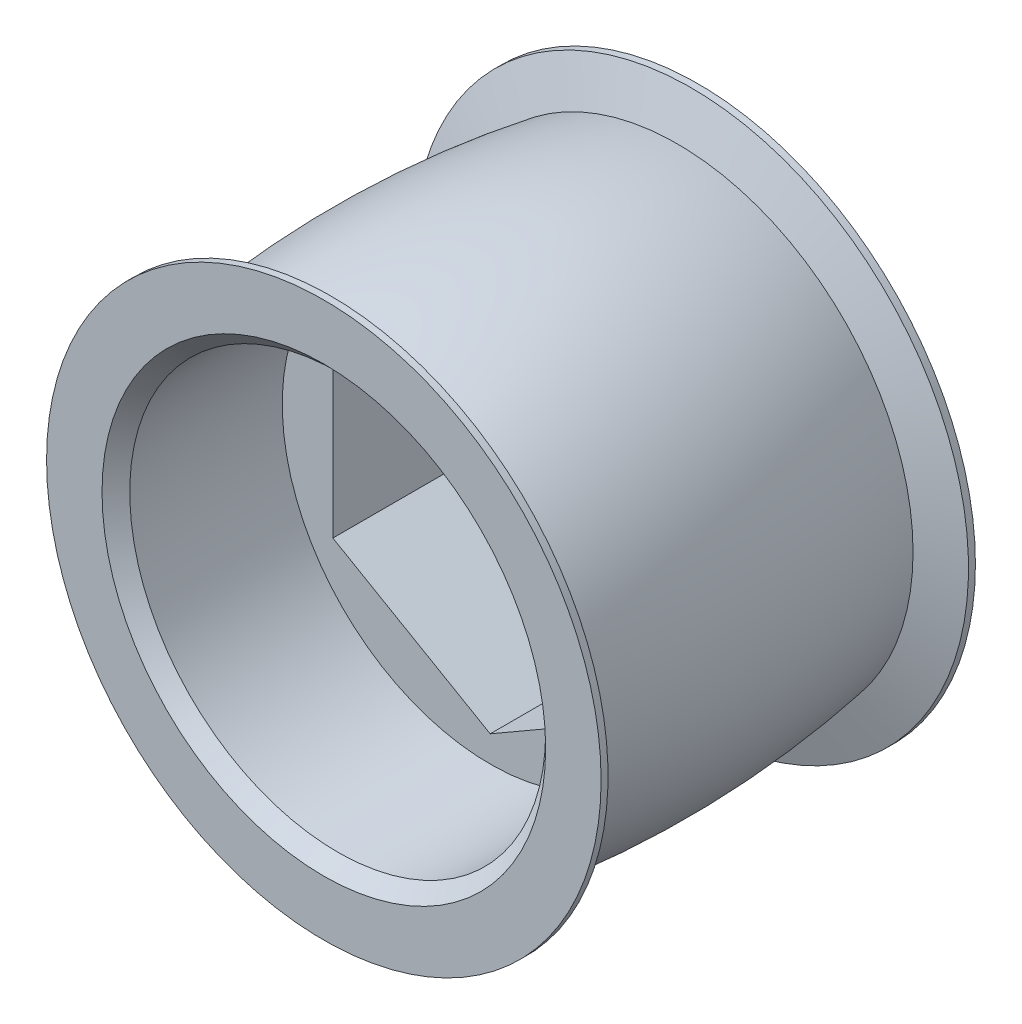
ISO-10303-21;
HEADER;
FILE_DESCRIPTION(('STEP AP214'),'2;1');
FILE_NAME('part.step','',(''),(''),'','','');
FILE_SCHEMA(('AUTOMOTIVE_DESIGN { 1 0 10303 214 1 1 1 1 }'));
ENDSEC;
DATA;
#1=APPLICATION_CONTEXT('core data for automotive mechanical design processes');
#2=APPLICATION_PROTOCOL_DEFINITION('international standard','automotive_design',2000,#1);
#3=PRODUCT_CONTEXT('',#1,'mechanical');
#4=PRODUCT('Part','Part','',(#3));
#5=PRODUCT_RELATED_PRODUCT_CATEGORY('part','',(#4));
#6=PRODUCT_DEFINITION_FORMATION('','',#4);
#7=PRODUCT_DEFINITION_CONTEXT('part definition',#1,'design');
#8=PRODUCT_DEFINITION('design','',#6,#7);
#9=PRODUCT_DEFINITION_SHAPE('','',#8);
#10=(LENGTH_UNIT() NAMED_UNIT(*) SI_UNIT(.MILLI.,.METRE.));
#11=(NAMED_UNIT(*) PLANE_ANGLE_UNIT() SI_UNIT($,.RADIAN.));
#12=(NAMED_UNIT(*) SI_UNIT($,.STERADIAN.) SOLID_ANGLE_UNIT());
#13=UNCERTAINTY_MEASURE_WITH_UNIT(LENGTH_MEASURE(1.E-05),#10,'distance_accuracy_value','');
#14=(GEOMETRIC_REPRESENTATION_CONTEXT(3) GLOBAL_UNCERTAINTY_ASSIGNED_CONTEXT((#13)) GLOBAL_UNIT_ASSIGNED_CONTEXT((#10,
#11,#12)) REPRESENTATION_CONTEXT('',''));
#15=CARTESIAN_POINT('',(0.,0.,0.));
#16=DIRECTION('',(0.,0.,1.));
#17=DIRECTION('',(1.,0.,0.));
#18=AXIS2_PLACEMENT_3D('',#15,#16,#17);
#19=CARTESIAN_POINT('',(0.,-8.,27.));
#20=DIRECTION('',(0.,0.,-1.));
#21=DIRECTION('',(-1.,0.,0.));
#22=AXIS2_PLACEMENT_3D('',#19,#20,#21);
#23=CYLINDRICAL_SURFACE('',#22,1.25);
#24=CARTESIAN_POINT('',(0.,-8.,7.));
#25=DIRECTION('',(0.,0.,1.));
#26=DIRECTION('',(1.,0.,0.));
#27=AXIS2_PLACEMENT_3D('',#24,#25,#26);
#28=CIRCLE('',#27,1.25);
#29=CARTESIAN_POINT('',(1.24999999999992,-8.,7.));
#30=VERTEX_POINT('',#29);
#31=EDGE_CURVE('E160',#30,#30,#28,.T.);
#32=ORIENTED_EDGE('',*,*,#31,.T.);
#33=EDGE_LOOP('',(#32));
#34=FACE_BOUND('',#33,.T.);
#35=CARTESIAN_POINT('',(0.,-8.,4.));
#36=DIRECTION('',(0.,0.,-1.));
#37=DIRECTION('',(-1.,0.,0.));
#38=AXIS2_PLACEMENT_3D('',#35,#36,#37);
#39=CIRCLE('',#38,1.25);
#40=CARTESIAN_POINT('',(-1.25000000000008,-8.,4.));
#41=VERTEX_POINT('',#40);
#42=EDGE_CURVE('E39',#41,#41,#39,.F.);
#43=ORIENTED_EDGE('',*,*,#42,.F.);
#44=EDGE_LOOP('',(#43));
#45=FACE_BOUND('',#44,.T.);
#46=ADVANCED_FACE('F35',(#34,#45),#23,.F.);
#47=CARTESIAN_POINT('',(-6.92820323027551,4.,27.));
#48=DIRECTION('',(0.,0.,-1.));
#49=DIRECTION('',(-1.,0.,0.));
#50=AXIS2_PLACEMENT_3D('',#47,#48,#49);
#51=CYLINDRICAL_SURFACE('',#50,1.25);
#52=CARTESIAN_POINT('',(-6.92820323027551,4.,7.));
#53=DIRECTION('',(0.,0.,1.));
#54=DIRECTION('',(1.,0.,0.));
#55=AXIS2_PLACEMENT_3D('',#52,#53,#54);
#56=CIRCLE('',#55,1.25);
#57=CARTESIAN_POINT('',(-5.67820323027551,4.,7.));
#58=VERTEX_POINT('',#57);
#59=EDGE_CURVE('E159',#58,#58,#56,.T.);
#60=ORIENTED_EDGE('',*,*,#59,.T.);
#61=EDGE_LOOP('',(#60));
#62=FACE_BOUND('',#61,.T.);
#63=CARTESIAN_POINT('',(-6.92820323027551,4.,4.));
#64=DIRECTION('',(0.,0.,-1.));
#65=DIRECTION('',(-1.,0.,0.));
#66=AXIS2_PLACEMENT_3D('',#63,#64,#65);
#67=CIRCLE('',#66,1.25);
#68=CARTESIAN_POINT('',(-8.17820323027551,4.,4.));
#69=VERTEX_POINT('',#68);
#70=EDGE_CURVE('E168',#69,#69,#67,.F.);
#71=ORIENTED_EDGE('',*,*,#70,.F.);
#72=EDGE_LOOP('',(#71));
#73=FACE_BOUND('',#72,.T.);
#74=ADVANCED_FACE('F230',(#62,#73),#51,.F.);
#75=CARTESIAN_POINT('',(6.92820323027553,3.99999999999996,27.));
#76=DIRECTION('',(0.,0.,-1.));
#77=DIRECTION('',(-1.,0.,0.));
#78=AXIS2_PLACEMENT_3D('',#75,#76,#77);
#79=CYLINDRICAL_SURFACE('',#78,1.25);
#80=CARTESIAN_POINT('',(6.92820323027553,3.99999999999996,7.));
#81=DIRECTION('',(0.,0.,1.));
#82=DIRECTION('',(1.,0.,0.));
#83=AXIS2_PLACEMENT_3D('',#80,#81,#82);
#84=CIRCLE('',#83,1.25);
#85=CARTESIAN_POINT('',(8.17820323027553,3.99999999999996,7.));
#86=VERTEX_POINT('',#85);
#87=EDGE_CURVE('E155',#86,#86,#84,.T.);
#88=ORIENTED_EDGE('',*,*,#87,.T.);
#89=EDGE_LOOP('',(#88));
#90=FACE_BOUND('',#89,.T.);
#91=CARTESIAN_POINT('',(6.92820323027553,3.99999999999996,4.));
#92=DIRECTION('',(0.,0.,-1.));
#93=DIRECTION('',(-1.,0.,0.));
#94=AXIS2_PLACEMENT_3D('',#91,#92,#93);
#95=CIRCLE('',#94,1.25);
#96=CARTESIAN_POINT('',(5.67820323027553,3.99999999999996,4.));
#97=VERTEX_POINT('',#96);
#98=EDGE_CURVE('E163',#97,#97,#95,.F.);
#99=ORIENTED_EDGE('',*,*,#98,.F.);
#100=EDGE_LOOP('',(#99));
#101=FACE_BOUND('',#100,.T.);
#102=ADVANCED_FACE('F236',(#90,#101),#79,.F.);
#103=CARTESIAN_POINT('',(0.,0.,15.));
#104=DIRECTION('',(0.,0.,-1.));
#105=DIRECTION('',(-1.,0.,0.));
#106=AXIS2_PLACEMENT_3D('',#103,#104,#105);
#107=CYLINDRICAL_SURFACE('',#106,20.);
#108=CARTESIAN_POINT('',(0.,0.,26.5));
#109=DIRECTION('',(0.,0.,-1.));
#110=DIRECTION('',(-1.,0.,0.));
#111=AXIS2_PLACEMENT_3D('',#108,#109,#110);
#112=CIRCLE('',#111,20.);
#113=CARTESIAN_POINT('',(-20.,0.,26.5));
#114=VERTEX_POINT('',#113);
#115=EDGE_CURVE('E201',#114,#114,#112,.T.);
#116=ORIENTED_EDGE('',*,*,#115,.F.);
#117=EDGE_LOOP('',(#116));
#118=FACE_BOUND('',#117,.T.);
#119=CARTESIAN_POINT('',(0.,0.,27.));
#120=DIRECTION('',(0.,0.,1.));
#121=DIRECTION('',(1.,0.,0.));
#122=AXIS2_PLACEMENT_3D('',#119,#120,#121);
#123=CIRCLE('',#122,20.);
#124=CARTESIAN_POINT('',(20.,0.,27.));
#125=VERTEX_POINT('',#124);
#126=EDGE_CURVE('E139',#125,#125,#123,.T.);
#127=ORIENTED_EDGE('',*,*,#126,.F.);
#128=EDGE_LOOP('',(#127));
#129=FACE_BOUND('',#128,.T.);
#130=ADVANCED_FACE('F244',(#118,#129),#107,.T.);
#131=CARTESIAN_POINT('',(0.,0.,15.));
#132=DIRECTION('',(0.,0.,-1.));
#133=DIRECTION('',(-1.,0.,0.));
#134=AXIS2_PLACEMENT_3D('',#131,#132,#133);
#135=CYLINDRICAL_SURFACE('',#134,3.25);
#136=CARTESIAN_POINT('',(0.,0.,0.));
#137=DIRECTION('',(0.,0.,1.));
#138=DIRECTION('',(1.,0.,0.));
#139=AXIS2_PLACEMENT_3D('',#136,#137,#138);
#140=CIRCLE('',#139,3.25);
#141=CARTESIAN_POINT('',(3.25,0.,0.));
#142=VERTEX_POINT('',#141);
#143=EDGE_CURVE('E142',#142,#142,#140,.T.);
#144=ORIENTED_EDGE('',*,*,#143,.F.);
#145=EDGE_LOOP('',(#144));
#146=FACE_BOUND('',#145,.T.);
#147=CARTESIAN_POINT('',(0.,0.,7.));
#148=DIRECTION('',(0.,0.,1.));
#149=DIRECTION('',(1.,0.,0.));
#150=AXIS2_PLACEMENT_3D('',#147,#148,#149);
#151=CIRCLE('',#150,3.25);
#152=CARTESIAN_POINT('',(3.25,0.,7.));
#153=VERTEX_POINT('',#152);
#154=EDGE_CURVE('E138',#153,#153,#151,.T.);
#155=ORIENTED_EDGE('',*,*,#154,.T.);
#156=EDGE_LOOP('',(#155));
#157=FACE_BOUND('',#156,.T.);
#158=ADVANCED_FACE('F281',(#146,#157),#135,.F.);
#159=CARTESIAN_POINT('',(0.,0.,15.));
#160=DIRECTION('',(0.,0.,1.));
#161=DIRECTION('',(1.,0.,0.));
#162=AXIS2_PLACEMENT_3D('',#159,#160,#161);
#163=PLANE('',#162);
#164=DIRECTION('',(0.866025403784439,0.5,0.));
#165=VECTOR('',#164,1.);
#166=CARTESIAN_POINT('',(0.,-13.1058511106045,15.));
#167=LINE('',#166,#165);
#168=CARTESIAN_POINT('',(0.,-13.1058511106045,15.));
#169=VERTEX_POINT('',#168);
#170=CARTESIAN_POINT('',(11.35,-6.55292555530226,15.));
#171=VERTEX_POINT('',#170);
#172=EDGE_CURVE('E52',#169,#171,#167,.T.);
#173=ORIENTED_EDGE('',*,*,#172,.F.);
#174=DIRECTION('',(0.866025403784439,-0.5,0.));
#175=VECTOR('',#174,1.);
#176=CARTESIAN_POINT('',(-11.35,-6.55292555530225,15.));
#177=LINE('',#176,#175);
#178=CARTESIAN_POINT('',(-11.35,-6.55292555530225,15.));
#179=VERTEX_POINT('',#178);
#180=EDGE_CURVE('E126',#179,#169,#177,.T.);
#181=ORIENTED_EDGE('',*,*,#180,.F.);
#182=DIRECTION('',(0.,-1.,0.));
#183=VECTOR('',#182,1.);
#184=CARTESIAN_POINT('',(-11.35,6.55292555530226,15.));
#185=LINE('',#184,#183);
#186=CARTESIAN_POINT('',(-11.35,6.55292555530226,15.));
#187=VERTEX_POINT('',#186);
#188=EDGE_CURVE('E120',#187,#179,#185,.T.);
#189=ORIENTED_EDGE('',*,*,#188,.F.);
#190=DIRECTION('',(-0.866025403784439,-0.5,0.));
#191=VECTOR('',#190,1.);
#192=CARTESIAN_POINT('',(0.,13.1058511106045,15.));
#193=LINE('',#192,#191);
#194=CARTESIAN_POINT('',(0.,13.1058511106045,15.));
#195=VERTEX_POINT('',#194);
#196=EDGE_CURVE('E118',#195,#187,#193,.T.);
#197=ORIENTED_EDGE('',*,*,#196,.F.);
#198=DIRECTION('',(-0.866025403784439,0.5,0.));
#199=VECTOR('',#198,1.);
#200=CARTESIAN_POINT('',(11.35,6.55292555530226,15.));
#201=LINE('',#200,#199);
#202=CARTESIAN_POINT('',(11.35,6.55292555530226,15.));
#203=VERTEX_POINT('',#202);
#204=EDGE_CURVE('E103',#203,#195,#201,.T.);
#205=ORIENTED_EDGE('',*,*,#204,.F.);
#206=DIRECTION('',(0.,1.,0.));
#207=VECTOR('',#206,1.);
#208=CARTESIAN_POINT('',(11.35,-6.55292555530226,15.));
#209=LINE('',#208,#207);
#210=EDGE_CURVE('E110',#171,#203,#209,.T.);
#211=ORIENTED_EDGE('',*,*,#210,.F.);
#212=EDGE_LOOP('',(#173,#181,#189,#197,#205,#211));
#213=FACE_BOUND('',#212,.T.);
#214=CARTESIAN_POINT('',(0.,0.,15.));
#215=DIRECTION('',(0.,0.,1.));
#216=DIRECTION('',(1.,0.,0.));
#217=AXIS2_PLACEMENT_3D('',#214,#215,#216);
#218=CIRCLE('',#217,15.);
#219=CARTESIAN_POINT('',(15.,0.,15.));
#220=VERTEX_POINT('',#219);
#221=EDGE_CURVE('E148',#220,#220,#218,.F.);
#222=ORIENTED_EDGE('',*,*,#221,.F.);
#223=EDGE_LOOP('',(#222));
#224=FACE_BOUND('',#223,.T.);
#225=ADVANCED_FACE('F114',(#213,#224),#163,.T.);
#226=CARTESIAN_POINT('',(0.,0.,0.));
#227=DIRECTION('',(0.,0.,1.));
#228=DIRECTION('',(1.,0.,0.));
#229=AXIS2_PLACEMENT_3D('',#226,#227,#228);
#230=PLANE('',#229);
#231=CARTESIAN_POINT('',(-6.92820323027551,4.,0.));
#232=DIRECTION('',(0.,0.,-1.));
#233=DIRECTION('',(-1.,0.,0.));
#234=AXIS2_PLACEMENT_3D('',#231,#232,#233);
#235=CIRCLE('',#234,4.25);
#236=CARTESIAN_POINT('',(-11.1782032302755,4.,0.));
#237=VERTEX_POINT('',#236);
#238=EDGE_CURVE('E176',#237,#237,#235,.T.);
#239=ORIENTED_EDGE('',*,*,#238,.F.);
#240=EDGE_LOOP('',(#239));
#241=FACE_BOUND('',#240,.T.);
#242=CARTESIAN_POINT('',(0.,-8.,0.));
#243=DIRECTION('',(0.,0.,-1.));
#244=DIRECTION('',(-1.,0.,0.));
#245=AXIS2_PLACEMENT_3D('',#242,#243,#244);
#246=CIRCLE('',#245,4.25);
#247=CARTESIAN_POINT('',(-4.25000000000008,-8.,0.));
#248=VERTEX_POINT('',#247);
#249=EDGE_CURVE('E186',#248,#248,#246,.T.);
#250=ORIENTED_EDGE('',*,*,#249,.F.);
#251=EDGE_LOOP('',(#250));
#252=FACE_BOUND('',#251,.T.);
#253=CARTESIAN_POINT('',(6.92820323027553,3.99999999999996,0.));
#254=DIRECTION('',(0.,0.,-1.));
#255=DIRECTION('',(-1.,0.,0.));
#256=AXIS2_PLACEMENT_3D('',#253,#254,#255);
#257=CIRCLE('',#256,4.25);
#258=CARTESIAN_POINT('',(2.67820323027553,3.99999999999996,0.));
#259=VERTEX_POINT('',#258);
#260=EDGE_CURVE('E174',#259,#259,#257,.T.);
#261=ORIENTED_EDGE('',*,*,#260,.F.);
#262=EDGE_LOOP('',(#261));
#263=FACE_BOUND('',#262,.T.);
#264=CARTESIAN_POINT('',(0.,0.,0.));
#265=DIRECTION('',(0.,0.,1.));
#266=DIRECTION('',(1.,0.,0.));
#267=AXIS2_PLACEMENT_3D('',#264,#265,#266);
#268=CIRCLE('',#267,20.);
#269=CARTESIAN_POINT('',(20.,0.,0.));
#270=VERTEX_POINT('',#269);
#271=EDGE_CURVE('E145',#270,#270,#268,.T.);
#272=ORIENTED_EDGE('',*,*,#271,.F.);
#273=EDGE_LOOP('',(#272));
#274=FACE_BOUND('',#273,.T.);
#275=ORIENTED_EDGE('',*,*,#143,.T.);
#276=EDGE_LOOP('',(#275));
#277=FACE_BOUND('',#276,.T.);
#278=ADVANCED_FACE('F287',(#241,#252,#263,#274,#277),#230,.F.);
#279=CARTESIAN_POINT('',(0.,0.,0.5));
#280=DIRECTION('',(0.,0.,-1.));
#281=DIRECTION('',(-1.,0.,0.));
#282=AXIS2_PLACEMENT_3D('',#279,#280,#281);
#283=CIRCLE('',#282,20.);
#284=CARTESIAN_POINT('',(-20.,0.,0.5));
#285=VERTEX_POINT('',#284);
#286=EDGE_CURVE('E198',#285,#285,#283,.T.);
#287=ORIENTED_EDGE('',*,*,#286,.T.);
#288=EDGE_LOOP('',(#287));
#289=FACE_BOUND('',#288,.T.);
#290=ORIENTED_EDGE('',*,*,#271,.T.);
#291=EDGE_LOOP('',(#290));
#292=FACE_BOUND('',#291,.T.);
#293=ADVANCED_FACE('F279',(#289,#292),#107,.T.);
#294=CARTESIAN_POINT('',(0.,0.,27.));
#295=DIRECTION('',(0.,0.,1.));
#296=DIRECTION('',(1.,0.,0.));
#297=AXIS2_PLACEMENT_3D('',#294,#295,#296);
#298=PLANE('',#297);
#299=CARTESIAN_POINT('',(0.,0.,27.));
#300=DIRECTION('',(0.,0.,1.));
#301=DIRECTION('',(1.,0.,0.));
#302=AXIS2_PLACEMENT_3D('',#299,#300,#301);
#303=CIRCLE('',#302,16.);
#304=CARTESIAN_POINT('',(16.,0.,27.));
#305=VERTEX_POINT('',#304);
#306=EDGE_CURVE('E12',#305,#305,#303,.F.);
#307=ORIENTED_EDGE('',*,*,#306,.T.);
#308=EDGE_LOOP('',(#307));
#309=FACE_BOUND('',#308,.T.);
#310=ORIENTED_EDGE('',*,*,#126,.T.);
#311=EDGE_LOOP('',(#310));
#312=FACE_BOUND('',#311,.T.);
#313=ADVANCED_FACE('F272',(#309,#312),#298,.T.);
#314=CARTESIAN_POINT('',(0.,0.,27.));
#315=DIRECTION('',(0.,0.,-1.));
#316=DIRECTION('',(-1.,0.,0.));
#317=AXIS2_PLACEMENT_3D('',#314,#315,#316);
#318=CYLINDRICAL_SURFACE('',#317,15.);
#319=CARTESIAN_POINT('',(0.,0.,26.));
#320=DIRECTION('',(0.,0.,1.));
#321=DIRECTION('',(1.,0.,0.));
#322=AXIS2_PLACEMENT_3D('',#319,#320,#321);
#323=CIRCLE('',#322,15.);
#324=CARTESIAN_POINT('',(15.,0.,26.));
#325=VERTEX_POINT('',#324);
#326=EDGE_CURVE('E44',#325,#325,#323,.T.);
#327=ORIENTED_EDGE('',*,*,#326,.T.);
#328=EDGE_LOOP('',(#327));
#329=FACE_BOUND('',#328,.T.);
#330=ORIENTED_EDGE('',*,*,#221,.T.);
#331=EDGE_LOOP('',(#330));
#332=FACE_BOUND('',#331,.T.);
#333=ADVANCED_FACE('F267',(#329,#332),#318,.F.);
#334=CARTESIAN_POINT('',(0.,-13.1058511106045,-34.6748227584992));
#335=DIRECTION('',(0.5,-0.866025403784439,0.));
#336=DIRECTION('',(0.866025403784439,0.5,0.));
#337=AXIS2_PLACEMENT_3D('',#334,#335,#336);
#338=PLANE('',#337);
#339=DIRECTION('',(-0.866025403784439,-0.5,0.));
#340=VECTOR('',#339,1.);
#341=CARTESIAN_POINT('',(0.,-13.1058511106045,7.));
#342=LINE('',#341,#340);
#343=CARTESIAN_POINT('',(11.35,-6.55292555530226,7.));
#344=VERTEX_POINT('',#343);
#345=CARTESIAN_POINT('',(0.,-13.1058511106045,7.));
#346=VERTEX_POINT('',#345);
#347=EDGE_CURVE('E71',#344,#346,#342,.T.);
#348=ORIENTED_EDGE('',*,*,#347,.T.);
#349=DIRECTION('',(0.,0.,1.));
#350=VECTOR('',#349,1.);
#351=CARTESIAN_POINT('',(0.,-13.1058511106045,-34.6748227584992));
#352=LINE('',#351,#350);
#353=EDGE_CURVE('E129',#346,#169,#352,.T.);
#354=ORIENTED_EDGE('',*,*,#353,.T.);
#355=ORIENTED_EDGE('',*,*,#172,.T.);
#356=DIRECTION('',(0.,0.,1.));
#357=VECTOR('',#356,1.);
#358=CARTESIAN_POINT('',(11.35,-6.55292555530226,-34.6748227584992));
#359=LINE('',#358,#357);
#360=EDGE_CURVE('E107',#344,#171,#359,.T.);
#361=ORIENTED_EDGE('',*,*,#360,.F.);
#362=EDGE_LOOP('',(#348,#354,#355,#361));
#363=FACE_BOUND('',#362,.T.);
#364=ADVANCED_FACE('F263',(#363),#338,.F.);
#365=CARTESIAN_POINT('',(-11.35,-6.55292555530225,-34.6748227584992));
#366=DIRECTION('',(-0.5,-0.866025403784439,0.));
#367=DIRECTION('',(0.866025403784439,-0.5,0.));
#368=AXIS2_PLACEMENT_3D('',#365,#366,#367);
#369=PLANE('',#368);
#370=DIRECTION('',(-0.866025403784439,0.5,0.));
#371=VECTOR('',#370,1.);
#372=CARTESIAN_POINT('',(-11.35,-6.55292555530225,7.));
#373=LINE('',#372,#371);
#374=CARTESIAN_POINT('',(-11.35,-6.55292555530225,7.));
#375=VERTEX_POINT('',#374);
#376=EDGE_CURVE('E208',#346,#375,#373,.T.);
#377=ORIENTED_EDGE('',*,*,#376,.T.);
#378=DIRECTION('',(0.,0.,1.));
#379=VECTOR('',#378,1.);
#380=CARTESIAN_POINT('',(-11.35,-6.55292555530225,-34.6748227584992));
#381=LINE('',#380,#379);
#382=EDGE_CURVE('E131',#375,#179,#381,.T.);
#383=ORIENTED_EDGE('',*,*,#382,.T.);
#384=ORIENTED_EDGE('',*,*,#180,.T.);
#385=ORIENTED_EDGE('',*,*,#353,.F.);
#386=EDGE_LOOP('',(#377,#383,#384,#385));
#387=FACE_BOUND('',#386,.T.);
#388=ADVANCED_FACE('F213',(#387),#369,.F.);
#389=CARTESIAN_POINT('',(-11.35,6.55292555530226,-34.6748227584992));
#390=DIRECTION('',(-1.,0.,0.));
#391=DIRECTION('',(0.,-1.,0.));
#392=AXIS2_PLACEMENT_3D('',#389,#390,#391);
#393=PLANE('',#392);
#394=DIRECTION('',(0.,1.,0.));
#395=VECTOR('',#394,1.);
#396=CARTESIAN_POINT('',(-11.35,6.55292555530226,7.));
#397=LINE('',#396,#395);
#398=CARTESIAN_POINT('',(-11.35,6.55292555530226,7.));
#399=VERTEX_POINT('',#398);
#400=EDGE_CURVE('E206',#375,#399,#397,.T.);
#401=ORIENTED_EDGE('',*,*,#400,.T.);
#402=DIRECTION('',(0.,0.,1.));
#403=VECTOR('',#402,1.);
#404=CARTESIAN_POINT('',(-11.35,6.55292555530226,-34.6748227584992));
#405=LINE('',#404,#403);
#406=EDGE_CURVE('E133',#399,#187,#405,.T.);
#407=ORIENTED_EDGE('',*,*,#406,.T.);
#408=ORIENTED_EDGE('',*,*,#188,.T.);
#409=ORIENTED_EDGE('',*,*,#382,.F.);
#410=EDGE_LOOP('',(#401,#407,#408,#409));
#411=FACE_BOUND('',#410,.T.);
#412=ADVANCED_FACE('F218',(#411),#393,.F.);
#413=CARTESIAN_POINT('',(0.,13.1058511106045,-34.6748227584992));
#414=DIRECTION('',(-0.5,0.866025403784439,0.));
#415=DIRECTION('',(-0.866025403784439,-0.5,0.));
#416=AXIS2_PLACEMENT_3D('',#413,#414,#415);
#417=PLANE('',#416);
#418=DIRECTION('',(0.866025403784439,0.5,0.));
#419=VECTOR('',#418,1.);
#420=CARTESIAN_POINT('',(0.,13.1058511106045,7.));
#421=LINE('',#420,#419);
#422=CARTESIAN_POINT('',(0.,13.1058511106045,7.));
#423=VERTEX_POINT('',#422);
#424=EDGE_CURVE('E61',#399,#423,#421,.T.);
#425=ORIENTED_EDGE('',*,*,#424,.T.);
#426=DIRECTION('',(0.,0.,1.));
#427=VECTOR('',#426,1.);
#428=CARTESIAN_POINT('',(0.,13.1058511106045,-34.6748227584992));
#429=LINE('',#428,#427);
#430=EDGE_CURVE('E106',#423,#195,#429,.T.);
#431=ORIENTED_EDGE('',*,*,#430,.T.);
#432=ORIENTED_EDGE('',*,*,#196,.T.);
#433=ORIENTED_EDGE('',*,*,#406,.F.);
#434=EDGE_LOOP('',(#425,#431,#432,#433));
#435=FACE_BOUND('',#434,.T.);
#436=ADVANCED_FACE('F220',(#435),#417,.F.);
#437=CARTESIAN_POINT('',(11.35,6.55292555530226,-34.6748227584992));
#438=DIRECTION('',(0.5,0.866025403784439,0.));
#439=DIRECTION('',(-0.866025403784439,0.5,0.));
#440=AXIS2_PLACEMENT_3D('',#437,#438,#439);
#441=PLANE('',#440);
#442=DIRECTION('',(0.866025403784439,-0.5,0.));
#443=VECTOR('',#442,1.);
#444=CARTESIAN_POINT('',(11.35,6.55292555530226,7.));
#445=LINE('',#444,#443);
#446=CARTESIAN_POINT('',(11.35,6.55292555530226,7.));
#447=VERTEX_POINT('',#446);
#448=EDGE_CURVE('E105',#423,#447,#445,.T.);
#449=ORIENTED_EDGE('',*,*,#448,.T.);
#450=DIRECTION('',(0.,0.,1.));
#451=VECTOR('',#450,1.);
#452=CARTESIAN_POINT('',(11.35,6.55292555530226,-34.6748227584992));
#453=LINE('',#452,#451);
#454=EDGE_CURVE('E98',#447,#203,#453,.T.);
#455=ORIENTED_EDGE('',*,*,#454,.T.);
#456=ORIENTED_EDGE('',*,*,#204,.T.);
#457=ORIENTED_EDGE('',*,*,#430,.F.);
#458=EDGE_LOOP('',(#449,#455,#456,#457));
#459=FACE_BOUND('',#458,.T.);
#460=ADVANCED_FACE('F100',(#459),#441,.F.);
#461=CARTESIAN_POINT('',(11.35,-6.55292555530226,-34.6748227584992));
#462=DIRECTION('',(1.,0.,0.));
#463=DIRECTION('',(0.,1.,0.));
#464=AXIS2_PLACEMENT_3D('',#461,#462,#463);
#465=PLANE('',#464);
#466=DIRECTION('',(0.,-1.,0.));
#467=VECTOR('',#466,1.);
#468=CARTESIAN_POINT('',(11.35,-6.55292555530226,7.));
#469=LINE('',#468,#467);
#470=EDGE_CURVE('E80',#447,#344,#469,.T.);
#471=ORIENTED_EDGE('',*,*,#470,.T.);
#472=ORIENTED_EDGE('',*,*,#360,.T.);
#473=ORIENTED_EDGE('',*,*,#210,.T.);
#474=ORIENTED_EDGE('',*,*,#454,.F.);
#475=EDGE_LOOP('',(#471,#472,#473,#474));
#476=FACE_BOUND('',#475,.T.);
#477=ADVANCED_FACE('F111',(#476),#465,.F.);
#478=CARTESIAN_POINT('',(0.,0.,7.));
#479=DIRECTION('',(0.,0.,1.));
#480=DIRECTION('',(1.,0.,0.));
#481=AXIS2_PLACEMENT_3D('',#478,#479,#480);
#482=PLANE('',#481);
#483=ORIENTED_EDGE('',*,*,#59,.F.);
#484=EDGE_LOOP('',(#483));
#485=FACE_BOUND('',#484,.T.);
#486=ORIENTED_EDGE('',*,*,#31,.F.);
#487=EDGE_LOOP('',(#486));
#488=FACE_BOUND('',#487,.T.);
#489=ORIENTED_EDGE('',*,*,#87,.F.);
#490=EDGE_LOOP('',(#489));
#491=FACE_BOUND('',#490,.T.);
#492=ORIENTED_EDGE('',*,*,#154,.F.);
#493=EDGE_LOOP('',(#492));
#494=FACE_BOUND('',#493,.T.);
#495=ORIENTED_EDGE('',*,*,#347,.F.);
#496=ORIENTED_EDGE('',*,*,#470,.F.);
#497=ORIENTED_EDGE('',*,*,#448,.F.);
#498=ORIENTED_EDGE('',*,*,#424,.F.);
#499=ORIENTED_EDGE('',*,*,#400,.F.);
#500=ORIENTED_EDGE('',*,*,#376,.F.);
#501=EDGE_LOOP('',(#495,#496,#497,#498,#499,#500));
#502=FACE_BOUND('',#501,.T.);
#503=ADVANCED_FACE('F216',(#485,#488,#491,#494,#502),#482,.T.);
#504=CARTESIAN_POINT('',(0.,0.,26.));
#505=DIRECTION('',(0.,0.,1.));
#506=DIRECTION('',(1.,0.,0.));
#507=AXIS2_PLACEMENT_3D('',#504,#505,#506);
#508=CONICAL_SURFACE('',#507,15.,0.785398163397448);
#509=ORIENTED_EDGE('',*,*,#306,.F.);
#510=EDGE_LOOP('',(#509));
#511=FACE_BOUND('',#510,.T.);
#512=ORIENTED_EDGE('',*,*,#326,.F.);
#513=EDGE_LOOP('',(#512));
#514=FACE_BOUND('',#513,.T.);
#515=ADVANCED_FACE('F37',(#511,#514),#508,.F.);
#516=CARTESIAN_POINT('',(0.,0.,26.5));
#517=DIRECTION('',(0.,0.,1.));
#518=DIRECTION('',(1.,0.,0.));
#519=AXIS2_PLACEMENT_3D('',#516,#517,#518);
#520=CONICAL_SURFACE('',#519,20.,1.24904577239825);
#521=CARTESIAN_POINT('',(0.,0.,25.5));
#522=DIRECTION('',(0.,0.,-1.));
#523=DIRECTION('',(-1.,0.,0.));
#524=AXIS2_PLACEMENT_3D('',#521,#522,#523);
#525=CIRCLE('',#524,17.);
#526=CARTESIAN_POINT('',(-17.,0.,25.5));
#527=VERTEX_POINT('',#526);
#528=EDGE_CURVE('E158',#527,#527,#525,.T.);
#529=ORIENTED_EDGE('',*,*,#528,.F.);
#530=EDGE_LOOP('',(#529));
#531=FACE_BOUND('',#530,.T.);
#532=ORIENTED_EDGE('',*,*,#115,.T.);
#533=EDGE_LOOP('',(#532));
#534=FACE_BOUND('',#533,.T.);
#535=ADVANCED_FACE('F254',(#531,#534),#520,.T.);
#536=CARTESIAN_POINT('',(0.,0.,1.5));
#537=DIRECTION('',(0.,0.,-1.));
#538=DIRECTION('',(-1.,0.,0.));
#539=AXIS2_PLACEMENT_3D('',#536,#537,#538);
#540=CONICAL_SURFACE('',#539,17.,1.24904577239825);
#541=ORIENTED_EDGE('',*,*,#286,.F.);
#542=EDGE_LOOP('',(#541));
#543=FACE_BOUND('',#542,.T.);
#544=CARTESIAN_POINT('',(0.,0.,1.5));
#545=DIRECTION('',(0.,0.,-1.));
#546=DIRECTION('',(-1.,0.,0.));
#547=AXIS2_PLACEMENT_3D('',#544,#545,#546);
#548=CIRCLE('',#547,17.);
#549=CARTESIAN_POINT('',(-17.,0.,1.5));
#550=VERTEX_POINT('',#549);
#551=EDGE_CURVE('E195',#550,#550,#548,.T.);
#552=ORIENTED_EDGE('',*,*,#551,.T.);
#553=EDGE_LOOP('',(#552));
#554=FACE_BOUND('',#553,.T.);
#555=ADVANCED_FACE('F250',(#543,#554),#540,.T.);
#556=CARTESIAN_POINT('',(0.,0.,13.5));
#557=DIRECTION('',(0.,0.,-1.));
#558=DIRECTION('',(-1.,0.,0.));
#559=AXIS2_PLACEMENT_3D('',#556,#557,#558);
#560=DEGENERATE_TOROIDAL_SURFACE('',#559,54.4999999999998,72.4999999999998,.F.);
#561=ORIENTED_EDGE('',*,*,#551,.F.);
#562=EDGE_LOOP('',(#561));
#563=FACE_BOUND('',#562,.T.);
#564=ORIENTED_EDGE('',*,*,#528,.T.);
#565=EDGE_LOOP('',(#564));
#566=FACE_BOUND('',#565,.T.);
#567=ADVANCED_FACE('F246',(#563,#566),#560,.F.);
#568=CARTESIAN_POINT('',(6.92820323027553,3.99999999999996,4.));
#569=DIRECTION('',(0.,0.,-1.));
#570=DIRECTION('',(-1.,0.,0.));
#571=AXIS2_PLACEMENT_3D('',#568,#569,#570);
#572=PLANE('',#571);
#573=CARTESIAN_POINT('',(6.92820323027553,3.99999999999996,4.));
#574=DIRECTION('',(0.,0.,-1.));
#575=DIRECTION('',(-1.,0.,0.));
#576=AXIS2_PLACEMENT_3D('',#573,#574,#575);
#577=CIRCLE('',#576,4.25);
#578=CARTESIAN_POINT('',(2.67820323027553,3.99999999999996,4.));
#579=VERTEX_POINT('',#578);
#580=EDGE_CURVE('E167',#579,#579,#577,.T.);
#581=ORIENTED_EDGE('',*,*,#580,.T.);
#582=EDGE_LOOP('',(#581));
#583=FACE_BOUND('',#582,.T.);
#584=ORIENTED_EDGE('',*,*,#98,.T.);
#585=EDGE_LOOP('',(#584));
#586=FACE_BOUND('',#585,.T.);
#587=ADVANCED_FACE('F249',(#583,#586),#572,.T.);
#588=CARTESIAN_POINT('',(6.92820323027553,3.99999999999996,4.));
#589=DIRECTION('',(0.,0.,-1.));
#590=DIRECTION('',(-1.,0.,0.));
#591=AXIS2_PLACEMENT_3D('',#588,#589,#590);
#592=CYLINDRICAL_SURFACE('',#591,4.25);
#593=ORIENTED_EDGE('',*,*,#580,.F.);
#594=EDGE_LOOP('',(#593));
#595=FACE_BOUND('',#594,.T.);
#596=ORIENTED_EDGE('',*,*,#260,.T.);
#597=EDGE_LOOP('',(#596));
#598=FACE_BOUND('',#597,.T.);
#599=ADVANCED_FACE('F332',(#595,#598),#592,.F.);
#600=CARTESIAN_POINT('',(-6.92820323027551,4.,4.));
#601=DIRECTION('',(0.,0.,-1.));
#602=DIRECTION('',(-1.,0.,0.));
#603=AXIS2_PLACEMENT_3D('',#600,#601,#602);
#604=PLANE('',#603);
#605=CARTESIAN_POINT('',(-6.92820323027551,4.,4.));
#606=DIRECTION('',(0.,0.,-1.));
#607=DIRECTION('',(-1.,0.,0.));
#608=AXIS2_PLACEMENT_3D('',#605,#606,#607);
#609=CIRCLE('',#608,4.25);
#610=CARTESIAN_POINT('',(-11.1782032302755,4.,4.));
#611=VERTEX_POINT('',#610);
#612=EDGE_CURVE('E170',#611,#611,#609,.T.);
#613=ORIENTED_EDGE('',*,*,#612,.T.);
#614=EDGE_LOOP('',(#613));
#615=FACE_BOUND('',#614,.T.);
#616=ORIENTED_EDGE('',*,*,#70,.T.);
#617=EDGE_LOOP('',(#616));
#618=FACE_BOUND('',#617,.T.);
#619=ADVANCED_FACE('F343',(#615,#618),#604,.T.);
#620=CARTESIAN_POINT('',(-6.92820323027551,4.,4.));
#621=DIRECTION('',(0.,0.,-1.));
#622=DIRECTION('',(-1.,0.,0.));
#623=AXIS2_PLACEMENT_3D('',#620,#621,#622);
#624=CYLINDRICAL_SURFACE('',#623,4.25);
#625=ORIENTED_EDGE('',*,*,#612,.F.);
#626=EDGE_LOOP('',(#625));
#627=FACE_BOUND('',#626,.T.);
#628=ORIENTED_EDGE('',*,*,#238,.T.);
#629=EDGE_LOOP('',(#628));
#630=FACE_BOUND('',#629,.T.);
#631=ADVANCED_FACE('F352',(#627,#630),#624,.F.);
#632=CARTESIAN_POINT('',(0.,-8.,4.));
#633=DIRECTION('',(0.,0.,-1.));
#634=DIRECTION('',(-1.,0.,0.));
#635=AXIS2_PLACEMENT_3D('',#632,#633,#634);
#636=PLANE('',#635);
#637=CARTESIAN_POINT('',(0.,-8.,4.));
#638=DIRECTION('',(0.,0.,-1.));
#639=DIRECTION('',(-1.,0.,0.));
#640=AXIS2_PLACEMENT_3D('',#637,#638,#639);
#641=CIRCLE('',#640,4.25);
#642=CARTESIAN_POINT('',(-4.25000000000008,-8.,4.));
#643=VERTEX_POINT('',#642);
#644=EDGE_CURVE('E181',#643,#643,#641,.T.);
#645=ORIENTED_EDGE('',*,*,#644,.T.);
#646=EDGE_LOOP('',(#645));
#647=FACE_BOUND('',#646,.T.);
#648=ORIENTED_EDGE('',*,*,#42,.T.);
#649=EDGE_LOOP('',(#648));
#650=FACE_BOUND('',#649,.T.);
#651=ADVANCED_FACE('F361',(#647,#650),#636,.T.);
#652=CARTESIAN_POINT('',(0.,-8.,4.));
#653=DIRECTION('',(0.,0.,-1.));
#654=DIRECTION('',(-1.,0.,0.));
#655=AXIS2_PLACEMENT_3D('',#652,#653,#654);
#656=CYLINDRICAL_SURFACE('',#655,4.25);
#657=ORIENTED_EDGE('',*,*,#644,.F.);
#658=EDGE_LOOP('',(#657));
#659=FACE_BOUND('',#658,.T.);
#660=ORIENTED_EDGE('',*,*,#249,.T.);
#661=EDGE_LOOP('',(#660));
#662=FACE_BOUND('',#661,.T.);
#663=ADVANCED_FACE('F371',(#659,#662),#656,.F.);
#664=CLOSED_SHELL('',(#46,#74,#102,#130,#158,#225,#278,#293,#313,#333,#364,#388,#412,#436,#460,
#477,#503,#515,#535,#555,#567,#587,#599,#619,#631,#651,#663));
#665=MANIFOLD_SOLID_BREP('B2',#664);
#666=ADVANCED_BREP_SHAPE_REPRESENTATION('',(#18,#665),#14);
#667=SHAPE_DEFINITION_REPRESENTATION(#9,#666);
ENDSEC;
END-ISO-10303-21;
